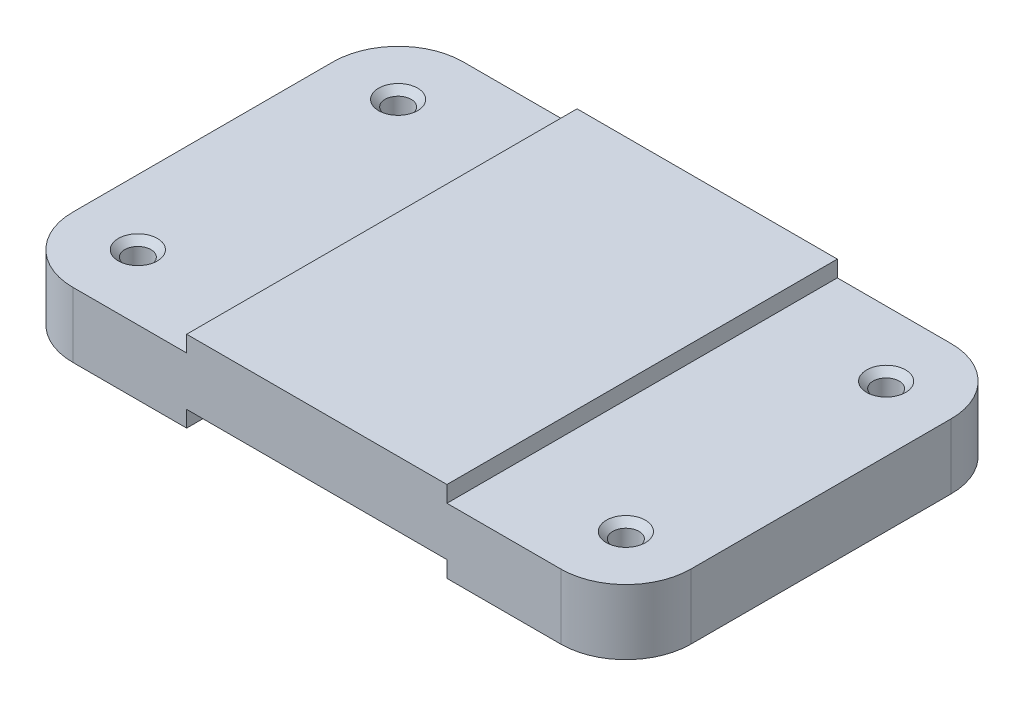
ISO-10303-21;
HEADER;
FILE_DESCRIPTION(('STEP AP214'),'2;1');
FILE_NAME('part.step','',(''),(''),'','','');
FILE_SCHEMA(('AUTOMOTIVE_DESIGN { 1 0 10303 214 1 1 1 1 }'));
ENDSEC;
DATA;
#1=APPLICATION_CONTEXT('core data for automotive mechanical design processes');
#2=APPLICATION_PROTOCOL_DEFINITION('international standard','automotive_design',2000,#1);
#3=PRODUCT_CONTEXT('',#1,'mechanical');
#4=PRODUCT('Part','Part','',(#3));
#5=PRODUCT_RELATED_PRODUCT_CATEGORY('part','',(#4));
#6=PRODUCT_DEFINITION_FORMATION('','',#4);
#7=PRODUCT_DEFINITION_CONTEXT('part definition',#1,'design');
#8=PRODUCT_DEFINITION('design','',#6,#7);
#9=PRODUCT_DEFINITION_SHAPE('','',#8);
#10=(LENGTH_UNIT() NAMED_UNIT(*) SI_UNIT(.MILLI.,.METRE.));
#11=(NAMED_UNIT(*) PLANE_ANGLE_UNIT() SI_UNIT($,.RADIAN.));
#12=(NAMED_UNIT(*) SI_UNIT($,.STERADIAN.) SOLID_ANGLE_UNIT());
#13=UNCERTAINTY_MEASURE_WITH_UNIT(LENGTH_MEASURE(1.E-05),#10,'distance_accuracy_value','');
#14=(GEOMETRIC_REPRESENTATION_CONTEXT(3) GLOBAL_UNCERTAINTY_ASSIGNED_CONTEXT((#13)) GLOBAL_UNIT_ASSIGNED_CONTEXT((#10,
#11,#12)) REPRESENTATION_CONTEXT('',''));
#15=CARTESIAN_POINT('',(0.,0.,0.));
#16=DIRECTION('',(0.,0.,1.));
#17=DIRECTION('',(1.,0.,0.));
#18=AXIS2_PLACEMENT_3D('',#15,#16,#17);
#19=CARTESIAN_POINT('',(-25.4,0.,38.1));
#20=DIRECTION('',(1.,0.,0.));
#21=DIRECTION('',(0.,0.,-1.));
#22=AXIS2_PLACEMENT_3D('',#19,#20,#21);
#23=PLANE('',#22);
#24=DIRECTION('',(0.,-1.,0.));
#25=VECTOR('',#24,1.);
#26=CARTESIAN_POINT('',(-25.4,0.,-38.1));
#27=LINE('',#26,#25);
#28=CARTESIAN_POINT('',(-25.4,0.,-38.1));
#29=VERTEX_POINT('',#28);
#30=CARTESIAN_POINT('',(-25.4,-3.17500000000012,-38.1));
#31=VERTEX_POINT('',#30);
#32=EDGE_CURVE('E191',#29,#31,#27,.T.);
#33=ORIENTED_EDGE('',*,*,#32,.T.);
#34=DIRECTION('',(0.,0.,-1.));
#35=VECTOR('',#34,1.);
#36=CARTESIAN_POINT('',(-25.4,-3.17500000000012,38.1));
#37=LINE('',#36,#35);
#38=CARTESIAN_POINT('',(-25.4,-3.17500000000012,38.1));
#39=VERTEX_POINT('',#38);
#40=EDGE_CURVE('E169',#39,#31,#37,.T.);
#41=ORIENTED_EDGE('',*,*,#40,.F.);
#42=DIRECTION('',(0.,-1.,0.));
#43=VECTOR('',#42,1.);
#44=CARTESIAN_POINT('',(-25.4,0.,38.1));
#45=LINE('',#44,#43);
#46=CARTESIAN_POINT('',(-25.4,0.,38.1));
#47=VERTEX_POINT('',#46);
#48=EDGE_CURVE('E178',#47,#39,#45,.T.);
#49=ORIENTED_EDGE('',*,*,#48,.F.);
#50=DIRECTION('',(0.,0.,-1.));
#51=VECTOR('',#50,1.);
#52=CARTESIAN_POINT('',(-25.4,0.,38.1));
#53=LINE('',#52,#51);
#54=EDGE_CURVE('E265',#47,#29,#53,.T.);
#55=ORIENTED_EDGE('',*,*,#54,.T.);
#56=EDGE_LOOP('',(#33,#41,#49,#55));
#57=FACE_BOUND('',#56,.T.);
#58=ADVANCED_FACE('F47',(#57),#23,.F.);
#59=CARTESIAN_POINT('',(-25.4,-3.17500000000012,38.1));
#60=DIRECTION('',(0.,-1.,0.));
#61=DIRECTION('',(1.,0.,0.));
#62=AXIS2_PLACEMENT_3D('',#59,#60,#61);
#63=PLANE('',#62);
#64=CARTESIAN_POINT('',(-47.625,-3.17500000000022,-25.4));
#65=DIRECTION('',(0.,1.,0.));
#66=DIRECTION('',(0.,0.,1.));
#67=AXIS2_PLACEMENT_3D('',#64,#65,#66);
#68=CIRCLE('',#67,3.81);
#69=CARTESIAN_POINT('',(-47.625,-3.17500000000022,-21.59));
#70=VERTEX_POINT('',#69);
#71=EDGE_CURVE('E696',#70,#70,#68,.T.);
#72=ORIENTED_EDGE('',*,*,#71,.F.);
#73=EDGE_LOOP('',(#72));
#74=FACE_BOUND('',#73,.T.);
#75=CARTESIAN_POINT('',(-47.625,-3.17500000000022,25.4));
#76=DIRECTION('',(0.,1.,0.));
#77=DIRECTION('',(0.,0.,1.));
#78=AXIS2_PLACEMENT_3D('',#75,#76,#77);
#79=CIRCLE('',#78,3.81);
#80=CARTESIAN_POINT('',(-47.625,-3.17500000000022,29.21));
#81=VERTEX_POINT('',#80);
#82=EDGE_CURVE('E706',#81,#81,#79,.T.);
#83=ORIENTED_EDGE('',*,*,#82,.F.);
#84=EDGE_LOOP('',(#83));
#85=FACE_BOUND('',#84,.T.);
#86=DIRECTION('',(-1.,0.,0.));
#87=VECTOR('',#86,1.);
#88=CARTESIAN_POINT('',(-25.4,-3.17500000000012,-38.1));
#89=LINE('',#88,#87);
#90=CARTESIAN_POINT('',(-47.625,-3.1750000000001,-38.1));
#91=VERTEX_POINT('',#90);
#92=EDGE_CURVE('E268',#31,#91,#89,.T.);
#93=ORIENTED_EDGE('',*,*,#92,.T.);
#94=CARTESIAN_POINT('',(-47.625,-3.1750000000001,-25.4));
#95=DIRECTION('',(0.,-1.,0.));
#96=DIRECTION('',(1.,0.,0.));
#97=AXIS2_PLACEMENT_3D('',#94,#95,#96);
#98=CIRCLE('',#97,12.7);
#99=CARTESIAN_POINT('',(-60.325,-3.17500000000009,-25.4));
#100=VERTEX_POINT('',#99);
#101=EDGE_CURVE('E222',#91,#100,#98,.F.);
#102=ORIENTED_EDGE('',*,*,#101,.T.);
#103=DIRECTION('',(0.,0.,-1.));
#104=VECTOR('',#103,1.);
#105=CARTESIAN_POINT('',(-60.325,-3.17500000000009,38.1));
#106=LINE('',#105,#104);
#107=CARTESIAN_POINT('',(-60.325,-3.17500000000009,25.4));
#108=VERTEX_POINT('',#107);
#109=EDGE_CURVE('E194',#108,#100,#106,.T.);
#110=ORIENTED_EDGE('',*,*,#109,.F.);
#111=CARTESIAN_POINT('',(-47.625,-3.1750000000001,25.4));
#112=DIRECTION('',(0.,-1.,0.));
#113=DIRECTION('',(1.,0.,0.));
#114=AXIS2_PLACEMENT_3D('',#111,#112,#113);
#115=CIRCLE('',#114,12.7);
#116=CARTESIAN_POINT('',(-47.625,-3.1750000000001,38.1));
#117=VERTEX_POINT('',#116);
#118=EDGE_CURVE('E173',#108,#117,#115,.F.);
#119=ORIENTED_EDGE('',*,*,#118,.T.);
#120=DIRECTION('',(-1.,0.,0.));
#121=VECTOR('',#120,1.);
#122=CARTESIAN_POINT('',(-25.4,-3.17500000000012,38.1));
#123=LINE('',#122,#121);
#124=EDGE_CURVE('E164',#39,#117,#123,.T.);
#125=ORIENTED_EDGE('',*,*,#124,.F.);
#126=ORIENTED_EDGE('',*,*,#40,.T.);
#127=EDGE_LOOP('',(#93,#102,#110,#119,#125,#126));
#128=FACE_BOUND('',#127,.T.);
#129=ADVANCED_FACE('F167',(#74,#85,#128),#63,.F.);
#130=CARTESIAN_POINT('',(-60.325,-3.17500000000009,38.1));
#131=DIRECTION('',(1.,0.,0.));
#132=DIRECTION('',(0.,1.,0.));
#133=AXIS2_PLACEMENT_3D('',#130,#131,#132);
#134=PLANE('',#133);
#135=ORIENTED_EDGE('',*,*,#109,.T.);
#136=DIRECTION('',(0.,-1.,0.));
#137=VECTOR('',#136,1.);
#138=CARTESIAN_POINT('',(-60.325,-15.875,-25.4));
#139=LINE('',#138,#137);
#140=CARTESIAN_POINT('',(-60.325,-15.875,-25.4));
#141=VERTEX_POINT('',#140);
#142=EDGE_CURVE('E198',#100,#141,#139,.T.);
#143=ORIENTED_EDGE('',*,*,#142,.T.);
#144=DIRECTION('',(0.,0.,-1.));
#145=VECTOR('',#144,1.);
#146=CARTESIAN_POINT('',(-60.325,-15.875,38.1));
#147=LINE('',#146,#145);
#148=CARTESIAN_POINT('',(-60.325,-15.875,25.4));
#149=VERTEX_POINT('',#148);
#150=EDGE_CURVE('E201',#149,#141,#147,.T.);
#151=ORIENTED_EDGE('',*,*,#150,.F.);
#152=DIRECTION('',(0.,-1.,0.));
#153=VECTOR('',#152,1.);
#154=CARTESIAN_POINT('',(-60.325,-3.17500000000009,25.4));
#155=LINE('',#154,#153);
#156=EDGE_CURVE('E193',#149,#108,#155,.F.);
#157=ORIENTED_EDGE('',*,*,#156,.T.);
#158=EDGE_LOOP('',(#135,#143,#151,#157));
#159=FACE_BOUND('',#158,.T.);
#160=ADVANCED_FACE('F335',(#159),#134,.F.);
#161=CARTESIAN_POINT('',(-60.325,-15.875,38.1));
#162=DIRECTION('',(0.,1.,0.));
#163=DIRECTION('',(-1.,0.,0.));
#164=AXIS2_PLACEMENT_3D('',#161,#162,#163);
#165=PLANE('',#164);
#166=CARTESIAN_POINT('',(-47.625,-15.8750000000003,-25.4));
#167=DIRECTION('',(0.,1.,0.));
#168=DIRECTION('',(0.,0.,1.));
#169=AXIS2_PLACEMENT_3D('',#166,#167,#168);
#170=CIRCLE('',#169,2.5527);
#171=CARTESIAN_POINT('',(-47.625,-15.8750000000003,-22.8473));
#172=VERTEX_POINT('',#171);
#173=EDGE_CURVE('E700',#172,#172,#170,.T.);
#174=ORIENTED_EDGE('',*,*,#173,.T.);
#175=EDGE_LOOP('',(#174));
#176=FACE_BOUND('',#175,.T.);
#177=CARTESIAN_POINT('',(-47.625,-15.8750000000003,25.4));
#178=DIRECTION('',(0.,1.,0.));
#179=DIRECTION('',(0.,0.,1.));
#180=AXIS2_PLACEMENT_3D('',#177,#178,#179);
#181=CIRCLE('',#180,2.5527);
#182=CARTESIAN_POINT('',(-47.625,-15.8750000000003,27.9527));
#183=VERTEX_POINT('',#182);
#184=EDGE_CURVE('E714',#183,#183,#181,.T.);
#185=ORIENTED_EDGE('',*,*,#184,.T.);
#186=EDGE_LOOP('',(#185));
#187=FACE_BOUND('',#186,.T.);
#188=ORIENTED_EDGE('',*,*,#150,.T.);
#189=CARTESIAN_POINT('',(-47.625,-15.875,-25.4));
#190=DIRECTION('',(0.,1.,0.));
#191=DIRECTION('',(-1.,0.,0.));
#192=AXIS2_PLACEMENT_3D('',#189,#190,#191);
#193=CIRCLE('',#192,12.7);
#194=CARTESIAN_POINT('',(-47.625,-15.875,-38.1));
#195=VERTEX_POINT('',#194);
#196=EDGE_CURVE('E211',#141,#195,#193,.F.);
#197=ORIENTED_EDGE('',*,*,#196,.T.);
#198=DIRECTION('',(1.,0.,0.));
#199=VECTOR('',#198,1.);
#200=CARTESIAN_POINT('',(-60.325,-15.875,-38.1));
#201=LINE('',#200,#199);
#202=CARTESIAN_POINT('',(-25.4,-15.8750000000001,-38.1));
#203=VERTEX_POINT('',#202);
#204=EDGE_CURVE('E272',#195,#203,#201,.T.);
#205=ORIENTED_EDGE('',*,*,#204,.T.);
#206=DIRECTION('',(0.,0.,-1.));
#207=VECTOR('',#206,1.);
#208=CARTESIAN_POINT('',(-25.4,-15.8750000000001,38.1));
#209=LINE('',#208,#207);
#210=CARTESIAN_POINT('',(-25.4,-15.8750000000001,38.1));
#211=VERTEX_POINT('',#210);
#212=EDGE_CURVE('E323',#211,#203,#209,.T.);
#213=ORIENTED_EDGE('',*,*,#212,.F.);
#214=DIRECTION('',(1.,0.,0.));
#215=VECTOR('',#214,1.);
#216=CARTESIAN_POINT('',(-60.325,-15.875,38.1));
#217=LINE('',#216,#215);
#218=CARTESIAN_POINT('',(-47.625,-15.875,38.1));
#219=VERTEX_POINT('',#218);
#220=EDGE_CURVE('E177',#219,#211,#217,.T.);
#221=ORIENTED_EDGE('',*,*,#220,.F.);
#222=CARTESIAN_POINT('',(-47.625,-15.875,25.4));
#223=DIRECTION('',(0.,1.,0.));
#224=DIRECTION('',(-1.,0.,0.));
#225=AXIS2_PLACEMENT_3D('',#222,#223,#224);
#226=CIRCLE('',#225,12.7);
#227=EDGE_CURVE('E208',#219,#149,#226,.F.);
#228=ORIENTED_EDGE('',*,*,#227,.T.);
#229=EDGE_LOOP('',(#188,#197,#205,#213,#221,#228));
#230=FACE_BOUND('',#229,.T.);
#231=ADVANCED_FACE('F330',(#176,#187,#230),#165,.F.);
#232=CARTESIAN_POINT('',(-25.4,-15.8750000000001,38.1));
#233=DIRECTION('',(-1.,0.,0.));
#234=DIRECTION('',(0.,0.,1.));
#235=AXIS2_PLACEMENT_3D('',#232,#233,#234);
#236=PLANE('',#235);
#237=DIRECTION('',(0.,1.,0.));
#238=VECTOR('',#237,1.);
#239=CARTESIAN_POINT('',(-25.4,-15.8750000000001,-38.1));
#240=LINE('',#239,#238);
#241=CARTESIAN_POINT('',(-25.4,-12.7000000000001,-38.1));
#242=VERTEX_POINT('',#241);
#243=EDGE_CURVE('E275',#203,#242,#240,.T.);
#244=ORIENTED_EDGE('',*,*,#243,.T.);
#245=DIRECTION('',(0.,0.,-1.));
#246=VECTOR('',#245,1.);
#247=CARTESIAN_POINT('',(-25.4,-12.7000000000001,38.1));
#248=LINE('',#247,#246);
#249=CARTESIAN_POINT('',(-25.4,-12.7000000000001,38.1));
#250=VERTEX_POINT('',#249);
#251=EDGE_CURVE('E319',#250,#242,#248,.T.);
#252=ORIENTED_EDGE('',*,*,#251,.F.);
#253=DIRECTION('',(0.,1.,0.));
#254=VECTOR('',#253,1.);
#255=CARTESIAN_POINT('',(-25.4,-15.8750000000001,38.1));
#256=LINE('',#255,#254);
#257=EDGE_CURVE('E342',#211,#250,#256,.T.);
#258=ORIENTED_EDGE('',*,*,#257,.F.);
#259=ORIENTED_EDGE('',*,*,#212,.T.);
#260=EDGE_LOOP('',(#244,#252,#258,#259));
#261=FACE_BOUND('',#260,.T.);
#262=ADVANCED_FACE('F418',(#261),#236,.F.);
#263=CARTESIAN_POINT('',(-25.4,-12.7000000000001,38.1));
#264=DIRECTION('',(0.,1.,0.));
#265=DIRECTION('',(-1.,0.,0.));
#266=AXIS2_PLACEMENT_3D('',#263,#264,#265);
#267=PLANE('',#266);
#268=DIRECTION('',(1.,0.,0.));
#269=VECTOR('',#268,1.);
#270=CARTESIAN_POINT('',(-25.4,-12.7000000000001,-38.1));
#271=LINE('',#270,#269);
#272=CARTESIAN_POINT('',(25.4,-12.7000000000001,-38.1));
#273=VERTEX_POINT('',#272);
#274=EDGE_CURVE('E278',#242,#273,#271,.T.);
#275=ORIENTED_EDGE('',*,*,#274,.T.);
#276=DIRECTION('',(0.,0.,-1.));
#277=VECTOR('',#276,1.);
#278=CARTESIAN_POINT('',(25.4,-12.7000000000001,38.1));
#279=LINE('',#278,#277);
#280=CARTESIAN_POINT('',(25.4,-12.7000000000001,38.1));
#281=VERTEX_POINT('',#280);
#282=EDGE_CURVE('E315',#281,#273,#279,.T.);
#283=ORIENTED_EDGE('',*,*,#282,.F.);
#284=DIRECTION('',(1.,0.,0.));
#285=VECTOR('',#284,1.);
#286=CARTESIAN_POINT('',(-25.4,-12.7000000000001,38.1));
#287=LINE('',#286,#285);
#288=EDGE_CURVE('E345',#250,#281,#287,.T.);
#289=ORIENTED_EDGE('',*,*,#288,.F.);
#290=ORIENTED_EDGE('',*,*,#251,.T.);
#291=EDGE_LOOP('',(#275,#283,#289,#290));
#292=FACE_BOUND('',#291,.T.);
#293=ADVANCED_FACE('F370',(#292),#267,.F.);
#294=CARTESIAN_POINT('',(25.4,-12.7000000000001,38.1));
#295=DIRECTION('',(1.,0.,0.));
#296=DIRECTION('',(0.,0.,-1.));
#297=AXIS2_PLACEMENT_3D('',#294,#295,#296);
#298=PLANE('',#297);
#299=DIRECTION('',(0.,-1.,0.));
#300=VECTOR('',#299,1.);
#301=CARTESIAN_POINT('',(25.4,-12.7000000000001,-38.1));
#302=LINE('',#301,#300);
#303=CARTESIAN_POINT('',(25.4,-15.8750000000001,-38.1));
#304=VERTEX_POINT('',#303);
#305=EDGE_CURVE('E281',#273,#304,#302,.T.);
#306=ORIENTED_EDGE('',*,*,#305,.T.);
#307=DIRECTION('',(0.,0.,-1.));
#308=VECTOR('',#307,1.);
#309=CARTESIAN_POINT('',(25.4,-15.8750000000001,38.1));
#310=LINE('',#309,#308);
#311=CARTESIAN_POINT('',(25.4,-15.8750000000001,38.1));
#312=VERTEX_POINT('',#311);
#313=EDGE_CURVE('E311',#312,#304,#310,.T.);
#314=ORIENTED_EDGE('',*,*,#313,.F.);
#315=DIRECTION('',(0.,-1.,0.));
#316=VECTOR('',#315,1.);
#317=CARTESIAN_POINT('',(25.4,-12.7000000000001,38.1));
#318=LINE('',#317,#316);
#319=EDGE_CURVE('E259',#281,#312,#318,.T.);
#320=ORIENTED_EDGE('',*,*,#319,.F.);
#321=ORIENTED_EDGE('',*,*,#282,.T.);
#322=EDGE_LOOP('',(#306,#314,#320,#321));
#323=FACE_BOUND('',#322,.T.);
#324=ADVANCED_FACE('F355',(#323),#298,.F.);
#325=CARTESIAN_POINT('',(25.4,-15.8750000000001,38.1));
#326=DIRECTION('',(0.,1.,0.));
#327=DIRECTION('',(-1.,0.,0.));
#328=AXIS2_PLACEMENT_3D('',#325,#326,#327);
#329=PLANE('',#328);
#330=CARTESIAN_POINT('',(47.625,-15.8750000000001,25.4));
#331=DIRECTION('',(0.,1.,0.));
#332=DIRECTION('',(0.,0.,1.));
#333=AXIS2_PLACEMENT_3D('',#330,#331,#332);
#334=CIRCLE('',#333,2.5527);
#335=CARTESIAN_POINT('',(47.625,-15.8750000000001,27.9527));
#336=VERTEX_POINT('',#335);
#337=EDGE_CURVE('E726',#336,#336,#334,.T.);
#338=ORIENTED_EDGE('',*,*,#337,.T.);
#339=EDGE_LOOP('',(#338));
#340=FACE_BOUND('',#339,.T.);
#341=CARTESIAN_POINT('',(47.625,-15.8750000000001,-25.4));
#342=DIRECTION('',(0.,1.,0.));
#343=DIRECTION('',(0.,0.,1.));
#344=AXIS2_PLACEMENT_3D('',#341,#342,#343);
#345=CIRCLE('',#344,2.5527);
#346=CARTESIAN_POINT('',(47.625,-15.8750000000001,-22.8473));
#347=VERTEX_POINT('',#346);
#348=EDGE_CURVE('E269',#347,#347,#345,.T.);
#349=ORIENTED_EDGE('',*,*,#348,.T.);
#350=EDGE_LOOP('',(#349));
#351=FACE_BOUND('',#350,.T.);
#352=DIRECTION('',(1.,0.,0.));
#353=VECTOR('',#352,1.);
#354=CARTESIAN_POINT('',(25.4,-15.8750000000001,-38.1));
#355=LINE('',#354,#353);
#356=CARTESIAN_POINT('',(47.625,-15.875,-38.1));
#357=VERTEX_POINT('',#356);
#358=EDGE_CURVE('E284',#304,#357,#355,.T.);
#359=ORIENTED_EDGE('',*,*,#358,.T.);
#360=CARTESIAN_POINT('',(47.625,-15.875,-25.4));
#361=DIRECTION('',(0.,1.,0.));
#362=DIRECTION('',(-1.,0.,0.));
#363=AXIS2_PLACEMENT_3D('',#360,#361,#362);
#364=CIRCLE('',#363,12.7);
#365=CARTESIAN_POINT('',(60.325,-15.875,-25.4));
#366=VERTEX_POINT('',#365);
#367=EDGE_CURVE('E239',#357,#366,#364,.F.);
#368=ORIENTED_EDGE('',*,*,#367,.T.);
#369=DIRECTION('',(0.,0.,-1.));
#370=VECTOR('',#369,1.);
#371=CARTESIAN_POINT('',(60.325,-15.875,38.1));
#372=LINE('',#371,#370);
#373=CARTESIAN_POINT('',(60.325,-15.875,25.4));
#374=VERTEX_POINT('',#373);
#375=EDGE_CURVE('E307',#374,#366,#372,.T.);
#376=ORIENTED_EDGE('',*,*,#375,.F.);
#377=CARTESIAN_POINT('',(47.625,-15.875,25.4));
#378=DIRECTION('',(0.,1.,0.));
#379=DIRECTION('',(-1.,0.,0.));
#380=AXIS2_PLACEMENT_3D('',#377,#378,#379);
#381=CIRCLE('',#380,12.7);
#382=CARTESIAN_POINT('',(47.625,-15.875,38.1));
#383=VERTEX_POINT('',#382);
#384=EDGE_CURVE('E63',#374,#383,#381,.F.);
#385=ORIENTED_EDGE('',*,*,#384,.T.);
#386=DIRECTION('',(1.,0.,0.));
#387=VECTOR('',#386,1.);
#388=CARTESIAN_POINT('',(25.4,-15.8750000000001,38.1));
#389=LINE('',#388,#387);
#390=EDGE_CURVE('E245',#312,#383,#389,.T.);
#391=ORIENTED_EDGE('',*,*,#390,.F.);
#392=ORIENTED_EDGE('',*,*,#313,.T.);
#393=EDGE_LOOP('',(#359,#368,#376,#385,#391,#392));
#394=FACE_BOUND('',#393,.T.);
#395=ADVANCED_FACE('F358',(#340,#351,#394),#329,.F.);
#396=CARTESIAN_POINT('',(60.325,-15.875,38.1));
#397=DIRECTION('',(-1.,0.,0.));
#398=DIRECTION('',(0.,0.,1.));
#399=AXIS2_PLACEMENT_3D('',#396,#397,#398);
#400=PLANE('',#399);
#401=ORIENTED_EDGE('',*,*,#375,.T.);
#402=DIRECTION('',(0.,1.,0.));
#403=VECTOR('',#402,1.);
#404=CARTESIAN_POINT('',(60.325,-3.17500000000001,-25.4));
#405=LINE('',#404,#403);
#406=CARTESIAN_POINT('',(60.325,-3.17500000000001,-25.4));
#407=VERTEX_POINT('',#406);
#408=EDGE_CURVE('E228',#366,#407,#405,.T.);
#409=ORIENTED_EDGE('',*,*,#408,.T.);
#410=DIRECTION('',(0.,0.,-1.));
#411=VECTOR('',#410,1.);
#412=CARTESIAN_POINT('',(60.325,-3.17500000000001,38.1));
#413=LINE('',#412,#411);
#414=CARTESIAN_POINT('',(60.325,-3.17500000000001,25.4));
#415=VERTEX_POINT('',#414);
#416=EDGE_CURVE('E304',#415,#407,#413,.T.);
#417=ORIENTED_EDGE('',*,*,#416,.F.);
#418=DIRECTION('',(0.,1.,0.));
#419=VECTOR('',#418,1.);
#420=CARTESIAN_POINT('',(60.325,-15.875,25.4));
#421=LINE('',#420,#419);
#422=EDGE_CURVE('E225',#415,#374,#421,.F.);
#423=ORIENTED_EDGE('',*,*,#422,.T.);
#424=EDGE_LOOP('',(#401,#409,#417,#423));
#425=FACE_BOUND('',#424,.T.);
#426=ADVANCED_FACE('F361',(#425),#400,.F.);
#427=CARTESIAN_POINT('',(60.325,-3.17500000000001,38.1));
#428=DIRECTION('',(0.,-1.,0.));
#429=DIRECTION('',(1.,0.,0.));
#430=AXIS2_PLACEMENT_3D('',#427,#428,#429);
#431=PLANE('',#430);
#432=CARTESIAN_POINT('',(47.625,-3.17500000000003,25.4));
#433=DIRECTION('',(0.,1.,0.));
#434=DIRECTION('',(0.,0.,1.));
#435=AXIS2_PLACEMENT_3D('',#432,#433,#434);
#436=CIRCLE('',#435,3.81);
#437=CARTESIAN_POINT('',(47.625,-3.17500000000003,29.21));
#438=VERTEX_POINT('',#437);
#439=EDGE_CURVE('E718',#438,#438,#436,.T.);
#440=ORIENTED_EDGE('',*,*,#439,.F.);
#441=EDGE_LOOP('',(#440));
#442=FACE_BOUND('',#441,.T.);
#443=CARTESIAN_POINT('',(47.625,-3.17500000000003,-25.4));
#444=DIRECTION('',(0.,1.,0.));
#445=DIRECTION('',(0.,0.,1.));
#446=AXIS2_PLACEMENT_3D('',#443,#444,#445);
#447=CIRCLE('',#446,3.81);
#448=CARTESIAN_POINT('',(47.625,-3.17500000000003,-21.59));
#449=VERTEX_POINT('',#448);
#450=EDGE_CURVE('E729',#449,#449,#447,.T.);
#451=ORIENTED_EDGE('',*,*,#450,.F.);
#452=EDGE_LOOP('',(#451));
#453=FACE_BOUND('',#452,.T.);
#454=ORIENTED_EDGE('',*,*,#416,.T.);
#455=CARTESIAN_POINT('',(47.625,-3.17500000000004,-25.4));
#456=DIRECTION('',(0.,-1.,0.));
#457=DIRECTION('',(1.,0.,0.));
#458=AXIS2_PLACEMENT_3D('',#455,#456,#457);
#459=CIRCLE('',#458,12.7);
#460=CARTESIAN_POINT('',(47.625,-3.17500000000004,-38.1));
#461=VERTEX_POINT('',#460);
#462=EDGE_CURVE('E234',#407,#461,#459,.F.);
#463=ORIENTED_EDGE('',*,*,#462,.T.);
#464=DIRECTION('',(-1.,0.,0.));
#465=VECTOR('',#464,1.);
#466=CARTESIAN_POINT('',(60.325,-3.17500000000001,-38.1));
#467=LINE('',#466,#465);
#468=CARTESIAN_POINT('',(25.4,-3.17500000000008,-38.1));
#469=VERTEX_POINT('',#468);
#470=EDGE_CURVE('E288',#461,#469,#467,.T.);
#471=ORIENTED_EDGE('',*,*,#470,.T.);
#472=DIRECTION('',(0.,0.,-1.));
#473=VECTOR('',#472,1.);
#474=CARTESIAN_POINT('',(25.4,-3.17500000000008,38.1));
#475=LINE('',#474,#473);
#476=CARTESIAN_POINT('',(25.4,-3.17500000000008,38.1));
#477=VERTEX_POINT('',#476);
#478=EDGE_CURVE('E251',#477,#469,#475,.T.);
#479=ORIENTED_EDGE('',*,*,#478,.F.);
#480=DIRECTION('',(-1.,0.,0.));
#481=VECTOR('',#480,1.);
#482=CARTESIAN_POINT('',(60.325,-3.17500000000001,38.1));
#483=LINE('',#482,#481);
#484=CARTESIAN_POINT('',(47.625,-3.17500000000004,38.1));
#485=VERTEX_POINT('',#484);
#486=EDGE_CURVE('E243',#485,#477,#483,.T.);
#487=ORIENTED_EDGE('',*,*,#486,.F.);
#488=CARTESIAN_POINT('',(47.625,-3.17500000000004,25.4));
#489=DIRECTION('',(0.,-1.,0.));
#490=DIRECTION('',(1.,0.,0.));
#491=AXIS2_PLACEMENT_3D('',#488,#489,#490);
#492=CIRCLE('',#491,12.7);
#493=EDGE_CURVE('E71',#485,#415,#492,.F.);
#494=ORIENTED_EDGE('',*,*,#493,.T.);
#495=EDGE_LOOP('',(#454,#463,#471,#479,#487,#494));
#496=FACE_BOUND('',#495,.T.);
#497=ADVANCED_FACE('F248',(#442,#453,#496),#431,.F.);
#498=CARTESIAN_POINT('',(25.4,-3.17500000000008,38.1));
#499=DIRECTION('',(-1.,0.,0.));
#500=DIRECTION('',(0.,-1.,0.));
#501=AXIS2_PLACEMENT_3D('',#498,#499,#500);
#502=PLANE('',#501);
#503=DIRECTION('',(0.,1.,0.));
#504=VECTOR('',#503,1.);
#505=CARTESIAN_POINT('',(25.4,-3.17500000000008,-38.1));
#506=LINE('',#505,#504);
#507=CARTESIAN_POINT('',(25.4,0.,-38.1));
#508=VERTEX_POINT('',#507);
#509=EDGE_CURVE('E291',#469,#508,#506,.T.);
#510=ORIENTED_EDGE('',*,*,#509,.T.);
#511=DIRECTION('',(0.,0.,-1.));
#512=VECTOR('',#511,1.);
#513=CARTESIAN_POINT('',(25.4,0.,38.1));
#514=LINE('',#513,#512);
#515=CARTESIAN_POINT('',(25.4,0.,38.1));
#516=VERTEX_POINT('',#515);
#517=EDGE_CURVE('E298',#516,#508,#514,.T.);
#518=ORIENTED_EDGE('',*,*,#517,.F.);
#519=DIRECTION('',(0.,1.,0.));
#520=VECTOR('',#519,1.);
#521=CARTESIAN_POINT('',(25.4,-3.17500000000008,38.1));
#522=LINE('',#521,#520);
#523=EDGE_CURVE('E254',#477,#516,#522,.T.);
#524=ORIENTED_EDGE('',*,*,#523,.F.);
#525=ORIENTED_EDGE('',*,*,#478,.T.);
#526=EDGE_LOOP('',(#510,#518,#524,#525));
#527=FACE_BOUND('',#526,.T.);
#528=ADVANCED_FACE('F410',(#527),#502,.F.);
#529=CARTESIAN_POINT('',(-25.4,0.,38.1));
#530=DIRECTION('',(0.,-1.,0.));
#531=DIRECTION('',(1.,0.,0.));
#532=AXIS2_PLACEMENT_3D('',#529,#530,#531);
#533=PLANE('',#532);
#534=DIRECTION('',(-1.,0.,0.));
#535=VECTOR('',#534,1.);
#536=CARTESIAN_POINT('',(-25.4,0.,-38.1));
#537=LINE('',#536,#535);
#538=EDGE_CURVE('E188',#508,#29,#537,.T.);
#539=ORIENTED_EDGE('',*,*,#538,.T.);
#540=ORIENTED_EDGE('',*,*,#54,.F.);
#541=DIRECTION('',(-1.,0.,0.));
#542=VECTOR('',#541,1.);
#543=CARTESIAN_POINT('',(-25.4,0.,38.1));
#544=LINE('',#543,#542);
#545=EDGE_CURVE('E183',#516,#47,#544,.T.);
#546=ORIENTED_EDGE('',*,*,#545,.F.);
#547=ORIENTED_EDGE('',*,*,#517,.T.);
#548=EDGE_LOOP('',(#539,#540,#546,#547));
#549=FACE_BOUND('',#548,.T.);
#550=ADVANCED_FACE('F412',(#549),#533,.F.);
#551=CARTESIAN_POINT('',(0.,0.,38.1));
#552=DIRECTION('',(0.,0.,-1.));
#553=DIRECTION('',(-1.,0.,0.));
#554=AXIS2_PLACEMENT_3D('',#551,#552,#553);
#555=PLANE('',#554);
#556=ORIENTED_EDGE('',*,*,#124,.T.);
#557=DIRECTION('',(0.,-1.,0.));
#558=VECTOR('',#557,1.);
#559=CARTESIAN_POINT('',(-47.625,0.,38.1));
#560=LINE('',#559,#558);
#561=EDGE_CURVE('E11',#117,#219,#560,.T.);
#562=ORIENTED_EDGE('',*,*,#561,.T.);
#563=ORIENTED_EDGE('',*,*,#220,.T.);
#564=ORIENTED_EDGE('',*,*,#257,.T.);
#565=ORIENTED_EDGE('',*,*,#288,.T.);
#566=ORIENTED_EDGE('',*,*,#319,.T.);
#567=ORIENTED_EDGE('',*,*,#390,.T.);
#568=DIRECTION('',(0.,1.,0.));
#569=VECTOR('',#568,1.);
#570=CARTESIAN_POINT('',(47.625,0.,38.1));
#571=LINE('',#570,#569);
#572=EDGE_CURVE('E56',#383,#485,#571,.T.);
#573=ORIENTED_EDGE('',*,*,#572,.T.);
#574=ORIENTED_EDGE('',*,*,#486,.T.);
#575=ORIENTED_EDGE('',*,*,#523,.T.);
#576=ORIENTED_EDGE('',*,*,#545,.T.);
#577=ORIENTED_EDGE('',*,*,#48,.T.);
#578=EDGE_LOOP('',(#556,#562,#563,#564,#565,#566,#567,#573,#574,#575,#576,#577));
#579=FACE_BOUND('',#578,.T.);
#580=ADVANCED_FACE('F181',(#579),#555,.F.);
#581=CARTESIAN_POINT('',(0.,0.,-38.1));
#582=DIRECTION('',(0.,0.,-1.));
#583=DIRECTION('',(-1.,0.,0.));
#584=AXIS2_PLACEMENT_3D('',#581,#582,#583);
#585=PLANE('',#584);
#586=ORIENTED_EDGE('',*,*,#204,.F.);
#587=DIRECTION('',(0.,-1.,0.));
#588=VECTOR('',#587,1.);
#589=CARTESIAN_POINT('',(-47.625,-3.17500000000009,-38.1));
#590=LINE('',#589,#588);
#591=EDGE_CURVE('E217',#195,#91,#590,.F.);
#592=ORIENTED_EDGE('',*,*,#591,.T.);
#593=ORIENTED_EDGE('',*,*,#92,.F.);
#594=ORIENTED_EDGE('',*,*,#32,.F.);
#595=ORIENTED_EDGE('',*,*,#538,.F.);
#596=ORIENTED_EDGE('',*,*,#509,.F.);
#597=ORIENTED_EDGE('',*,*,#470,.F.);
#598=DIRECTION('',(0.,1.,0.));
#599=VECTOR('',#598,1.);
#600=CARTESIAN_POINT('',(47.625,-15.875,-38.1));
#601=LINE('',#600,#599);
#602=EDGE_CURVE('E214',#461,#357,#601,.F.);
#603=ORIENTED_EDGE('',*,*,#602,.T.);
#604=ORIENTED_EDGE('',*,*,#358,.F.);
#605=ORIENTED_EDGE('',*,*,#305,.F.);
#606=ORIENTED_EDGE('',*,*,#274,.F.);
#607=ORIENTED_EDGE('',*,*,#243,.F.);
#608=EDGE_LOOP('',(#586,#592,#593,#594,#595,#596,#597,#603,#604,#605,#606,#607));
#609=FACE_BOUND('',#608,.T.);
#610=ADVANCED_FACE('F387',(#609),#585,.T.);
#611=CARTESIAN_POINT('',(-47.625,-3.17500000000009,-25.4));
#612=DIRECTION('',(0.,1.,0.));
#613=DIRECTION('',(-1.,0.,0.));
#614=AXIS2_PLACEMENT_3D('',#611,#612,#613);
#615=CYLINDRICAL_SURFACE('',#614,12.7);
#616=ORIENTED_EDGE('',*,*,#101,.F.);
#617=ORIENTED_EDGE('',*,*,#591,.F.);
#618=ORIENTED_EDGE('',*,*,#196,.F.);
#619=ORIENTED_EDGE('',*,*,#142,.F.);
#620=EDGE_LOOP('',(#616,#617,#618,#619));
#621=FACE_BOUND('',#620,.T.);
#622=ADVANCED_FACE('F383',(#621),#615,.T.);
#623=CARTESIAN_POINT('',(47.625,-15.875,-25.4));
#624=DIRECTION('',(0.,-1.,0.));
#625=DIRECTION('',(0.,0.,-1.));
#626=AXIS2_PLACEMENT_3D('',#623,#624,#625);
#627=CYLINDRICAL_SURFACE('',#626,12.7);
#628=ORIENTED_EDGE('',*,*,#367,.F.);
#629=ORIENTED_EDGE('',*,*,#602,.F.);
#630=ORIENTED_EDGE('',*,*,#462,.F.);
#631=ORIENTED_EDGE('',*,*,#408,.F.);
#632=EDGE_LOOP('',(#628,#629,#630,#631));
#633=FACE_BOUND('',#632,.T.);
#634=ADVANCED_FACE('F386',(#633),#627,.T.);
#635=CARTESIAN_POINT('',(-47.625,0.,25.4));
#636=DIRECTION('',(0.,-1.,0.));
#637=DIRECTION('',(1.,0.,0.));
#638=AXIS2_PLACEMENT_3D('',#635,#636,#637);
#639=CYLINDRICAL_SURFACE('',#638,12.7);
#640=ORIENTED_EDGE('',*,*,#118,.F.);
#641=ORIENTED_EDGE('',*,*,#156,.F.);
#642=ORIENTED_EDGE('',*,*,#227,.F.);
#643=ORIENTED_EDGE('',*,*,#561,.F.);
#644=EDGE_LOOP('',(#640,#641,#642,#643));
#645=FACE_BOUND('',#644,.T.);
#646=ADVANCED_FACE('F338',(#645),#639,.T.);
#647=CARTESIAN_POINT('',(47.625,0.,25.4));
#648=DIRECTION('',(0.,1.,0.));
#649=DIRECTION('',(0.,0.,1.));
#650=AXIS2_PLACEMENT_3D('',#647,#648,#649);
#651=CYLINDRICAL_SURFACE('',#650,12.7);
#652=ORIENTED_EDGE('',*,*,#384,.F.);
#653=ORIENTED_EDGE('',*,*,#422,.F.);
#654=ORIENTED_EDGE('',*,*,#493,.F.);
#655=ORIENTED_EDGE('',*,*,#572,.F.);
#656=EDGE_LOOP('',(#652,#653,#654,#655));
#657=FACE_BOUND('',#656,.T.);
#658=ADVANCED_FACE('F49',(#657),#651,.T.);
#659=CARTESIAN_POINT('',(47.625,-3.17500000000004,-25.4));
#660=DIRECTION('',(0.,1.,0.));
#661=DIRECTION('',(0.,0.,1.));
#662=AXIS2_PLACEMENT_3D('',#659,#660,#661);
#663=CYLINDRICAL_SURFACE('',#662,2.5527);
#664=ORIENTED_EDGE('',*,*,#348,.F.);
#665=EDGE_LOOP('',(#664));
#666=FACE_BOUND('',#665,.T.);
#667=CARTESIAN_POINT('',(47.625,-4.43230000000004,-25.4));
#668=DIRECTION('',(0.,1.,0.));
#669=DIRECTION('',(0.,0.,1.));
#670=AXIS2_PLACEMENT_3D('',#667,#668,#669);
#671=CIRCLE('',#670,2.5527);
#672=CARTESIAN_POINT('',(47.625,-4.43230000000004,-22.8473));
#673=VERTEX_POINT('',#672);
#674=EDGE_CURVE('E733',#673,#673,#671,.T.);
#675=ORIENTED_EDGE('',*,*,#674,.T.);
#676=EDGE_LOOP('',(#675));
#677=FACE_BOUND('',#676,.T.);
#678=ADVANCED_FACE('F395',(#666,#677),#663,.F.);
#679=CARTESIAN_POINT('',(47.625,-3.17500000000003,-25.4));
#680=DIRECTION('',(0.,1.,0.));
#681=DIRECTION('',(0.,0.,1.));
#682=AXIS2_PLACEMENT_3D('',#679,#680,#681);
#683=CONICAL_SURFACE('',#682,3.81,0.785398163397449);
#684=ORIENTED_EDGE('',*,*,#674,.F.);
#685=EDGE_LOOP('',(#684));
#686=FACE_BOUND('',#685,.T.);
#687=ORIENTED_EDGE('',*,*,#450,.T.);
#688=EDGE_LOOP('',(#687));
#689=FACE_BOUND('',#688,.T.);
#690=ADVANCED_FACE('F399',(#686,#689),#683,.F.);
#691=CARTESIAN_POINT('',(47.625,-3.17500000000004,25.4));
#692=DIRECTION('',(0.,1.,0.));
#693=DIRECTION('',(0.,0.,1.));
#694=AXIS2_PLACEMENT_3D('',#691,#692,#693);
#695=CYLINDRICAL_SURFACE('',#694,2.5527);
#696=ORIENTED_EDGE('',*,*,#337,.F.);
#697=EDGE_LOOP('',(#696));
#698=FACE_BOUND('',#697,.T.);
#699=CARTESIAN_POINT('',(47.625,-4.43230000000004,25.4));
#700=DIRECTION('',(0.,1.,0.));
#701=DIRECTION('',(0.,0.,1.));
#702=AXIS2_PLACEMENT_3D('',#699,#700,#701);
#703=CIRCLE('',#702,2.5527);
#704=CARTESIAN_POINT('',(47.625,-4.43230000000004,27.9527));
#705=VERTEX_POINT('',#704);
#706=EDGE_CURVE('E722',#705,#705,#703,.T.);
#707=ORIENTED_EDGE('',*,*,#706,.T.);
#708=EDGE_LOOP('',(#707));
#709=FACE_BOUND('',#708,.T.);
#710=ADVANCED_FACE('F581',(#698,#709),#695,.F.);
#711=CARTESIAN_POINT('',(47.625,-3.17500000000003,25.4));
#712=DIRECTION('',(0.,1.,0.));
#713=DIRECTION('',(0.,0.,1.));
#714=AXIS2_PLACEMENT_3D('',#711,#712,#713);
#715=CONICAL_SURFACE('',#714,3.81,0.785398163397449);
#716=ORIENTED_EDGE('',*,*,#706,.F.);
#717=EDGE_LOOP('',(#716));
#718=FACE_BOUND('',#717,.T.);
#719=ORIENTED_EDGE('',*,*,#439,.T.);
#720=EDGE_LOOP('',(#719));
#721=FACE_BOUND('',#720,.T.);
#722=ADVANCED_FACE('F591',(#718,#721),#715,.F.);
#723=CARTESIAN_POINT('',(-47.625,-3.17500000000023,25.4));
#724=DIRECTION('',(0.,1.,0.));
#725=DIRECTION('',(0.,0.,1.));
#726=AXIS2_PLACEMENT_3D('',#723,#724,#725);
#727=CYLINDRICAL_SURFACE('',#726,2.5527);
#728=ORIENTED_EDGE('',*,*,#184,.F.);
#729=EDGE_LOOP('',(#728));
#730=FACE_BOUND('',#729,.T.);
#731=CARTESIAN_POINT('',(-47.625,-4.43230000000022,25.4));
#732=DIRECTION('',(0.,1.,0.));
#733=DIRECTION('',(0.,0.,1.));
#734=AXIS2_PLACEMENT_3D('',#731,#732,#733);
#735=CIRCLE('',#734,2.5527);
#736=CARTESIAN_POINT('',(-47.625,-4.43230000000022,27.9527));
#737=VERTEX_POINT('',#736);
#738=EDGE_CURVE('E710',#737,#737,#735,.T.);
#739=ORIENTED_EDGE('',*,*,#738,.T.);
#740=EDGE_LOOP('',(#739));
#741=FACE_BOUND('',#740,.T.);
#742=ADVANCED_FACE('F601',(#730,#741),#727,.F.);
#743=CARTESIAN_POINT('',(-47.625,-3.17500000000022,25.4));
#744=DIRECTION('',(0.,1.,0.));
#745=DIRECTION('',(0.,0.,1.));
#746=AXIS2_PLACEMENT_3D('',#743,#744,#745);
#747=CONICAL_SURFACE('',#746,3.81,0.785398163397449);
#748=ORIENTED_EDGE('',*,*,#738,.F.);
#749=EDGE_LOOP('',(#748));
#750=FACE_BOUND('',#749,.T.);
#751=ORIENTED_EDGE('',*,*,#82,.T.);
#752=EDGE_LOOP('',(#751));
#753=FACE_BOUND('',#752,.T.);
#754=ADVANCED_FACE('F611',(#750,#753),#747,.F.);
#755=CARTESIAN_POINT('',(-47.625,-3.17500000000023,-25.4));
#756=DIRECTION('',(0.,1.,0.));
#757=DIRECTION('',(0.,0.,1.));
#758=AXIS2_PLACEMENT_3D('',#755,#756,#757);
#759=CYLINDRICAL_SURFACE('',#758,2.5527);
#760=ORIENTED_EDGE('',*,*,#173,.F.);
#761=EDGE_LOOP('',(#760));
#762=FACE_BOUND('',#761,.T.);
#763=CARTESIAN_POINT('',(-47.625,-4.43230000000022,-25.4));
#764=DIRECTION('',(0.,1.,0.));
#765=DIRECTION('',(0.,0.,1.));
#766=AXIS2_PLACEMENT_3D('',#763,#764,#765);
#767=CIRCLE('',#766,2.5527);
#768=CARTESIAN_POINT('',(-47.625,-4.43230000000022,-22.8473));
#769=VERTEX_POINT('',#768);
#770=EDGE_CURVE('E693',#769,#769,#767,.T.);
#771=ORIENTED_EDGE('',*,*,#770,.T.);
#772=EDGE_LOOP('',(#771));
#773=FACE_BOUND('',#772,.T.);
#774=ADVANCED_FACE('F621',(#762,#773),#759,.F.);
#775=CARTESIAN_POINT('',(-47.625,-3.17500000000022,-25.4));
#776=DIRECTION('',(0.,1.,0.));
#777=DIRECTION('',(0.,0.,1.));
#778=AXIS2_PLACEMENT_3D('',#775,#776,#777);
#779=CONICAL_SURFACE('',#778,3.81,0.785398163397449);
#780=ORIENTED_EDGE('',*,*,#770,.F.);
#781=EDGE_LOOP('',(#780));
#782=FACE_BOUND('',#781,.T.);
#783=ORIENTED_EDGE('',*,*,#71,.T.);
#784=EDGE_LOOP('',(#783));
#785=FACE_BOUND('',#784,.T.);
#786=ADVANCED_FACE('F631',(#782,#785),#779,.F.);
#787=CLOSED_SHELL('',(#58,#129,#160,#231,#262,#293,#324,#395,#426,#497,#528,#550,#580,#610,#622,
#634,#646,#658,#678,#690,#710,#722,#742,#754,#774,#786));
#788=MANIFOLD_SOLID_BREP('B2',#787);
#789=ADVANCED_BREP_SHAPE_REPRESENTATION('',(#18,#788),#14);
#790=SHAPE_DEFINITION_REPRESENTATION(#9,#789);
ENDSEC;
END-ISO-10303-21;
